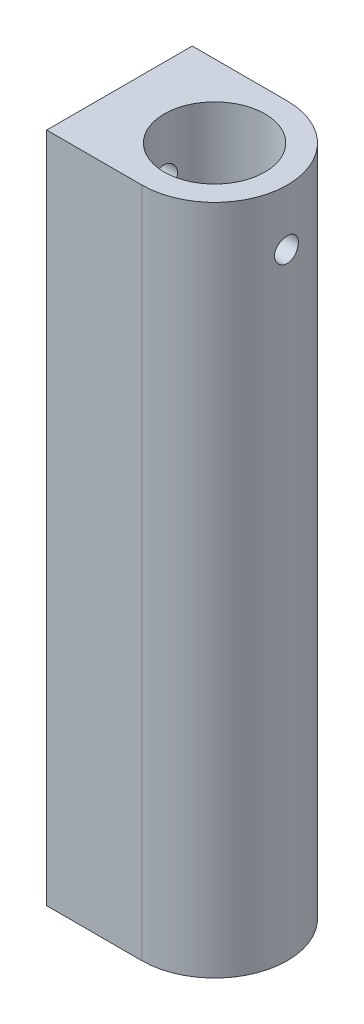
ISO-10303-21;
HEADER;
FILE_DESCRIPTION(('STEP AP214'),'2;1');
FILE_NAME('part.step','',(''),(''),'','','');
FILE_SCHEMA(('AUTOMOTIVE_DESIGN { 1 0 10303 214 1 1 1 1 }'));
ENDSEC;
DATA;
#1=APPLICATION_CONTEXT('core data for automotive mechanical design processes');
#2=APPLICATION_PROTOCOL_DEFINITION('international standard','automotive_design',2000,#1);
#3=PRODUCT_CONTEXT('',#1,'mechanical');
#4=PRODUCT('Part','Part','',(#3));
#5=PRODUCT_RELATED_PRODUCT_CATEGORY('part','',(#4));
#6=PRODUCT_DEFINITION_FORMATION('','',#4);
#7=PRODUCT_DEFINITION_CONTEXT('part definition',#1,'design');
#8=PRODUCT_DEFINITION('design','',#6,#7);
#9=PRODUCT_DEFINITION_SHAPE('','',#8);
#10=(LENGTH_UNIT() NAMED_UNIT(*) SI_UNIT(.MILLI.,.METRE.));
#11=(NAMED_UNIT(*) PLANE_ANGLE_UNIT() SI_UNIT($,.RADIAN.));
#12=(NAMED_UNIT(*) SI_UNIT($,.STERADIAN.) SOLID_ANGLE_UNIT());
#13=UNCERTAINTY_MEASURE_WITH_UNIT(LENGTH_MEASURE(1.E-05),#10,'distance_accuracy_value','');
#14=(GEOMETRIC_REPRESENTATION_CONTEXT(3) GLOBAL_UNCERTAINTY_ASSIGNED_CONTEXT((#13)) GLOBAL_UNIT_ASSIGNED_CONTEXT((#10,
#11,#12)) REPRESENTATION_CONTEXT('',''));
#15=CARTESIAN_POINT('',(0.,0.,0.));
#16=DIRECTION('',(0.,0.,1.));
#17=DIRECTION('',(1.,0.,0.));
#18=AXIS2_PLACEMENT_3D('',#15,#16,#17);
#19=CARTESIAN_POINT('',(0.,76.2,0.));
#20=DIRECTION('',(0.,-1.,0.));
#21=DIRECTION('',(0.,0.,-1.));
#22=AXIS2_PLACEMENT_3D('',#19,#20,#21);
#23=CYLINDRICAL_SURFACE('',#22,5.71500000000003);
#24=CARTESIAN_POINT('',(5.55264202857526,69.85,1.35254999999999));
#25=CARTESIAN_POINT('',(5.55264351524613,69.9248227648108,1.3525476616193));
#26=CARTESIAN_POINT('',(5.55417090006576,69.9996723482809,1.34632009430233));
#27=CARTESIAN_POINT('',(5.56010176398933,70.1472313061546,1.32160852948037));
#28=CARTESIAN_POINT('',(5.56450709471263,70.2199392711833,1.30311664121217));
#29=CARTESIAN_POINT('',(5.5756676105469,70.3610592934138,1.2545009118724));
#30=CARTESIAN_POINT('',(5.58241996342618,70.4294764115908,1.22439108576314));
#31=CARTESIAN_POINT('',(5.59751023452042,70.5602930408163,1.1534358149386));
#32=CARTESIAN_POINT('',(5.6058481765208,70.622692461572,1.11259020917229));
#33=CARTESIAN_POINT('',(5.62335427035189,70.7409345562503,1.02046227097579));
#34=CARTESIAN_POINT('',(5.63253454315145,70.7966409957032,0.96900735840718));
#35=CARTESIAN_POINT('',(5.65058534815188,70.898718744032,0.857493536514953));
#36=CARTESIAN_POINT('',(5.6594558535766,70.9450892475568,0.797433885680036));
#37=CARTESIAN_POINT('',(5.67602085762911,71.0277280916502,0.669490856613091));
#38=CARTESIAN_POINT('',(5.68369938377523,71.0638638253583,0.601519580684012));
#39=CARTESIAN_POINT('',(5.6968775869307,71.1241470655873,0.460256204066858));
#40=CARTESIAN_POINT('',(5.7023775511296,71.1482961523575,0.386964806213634));
#41=CARTESIAN_POINT('',(5.71049326078864,71.183487693132,0.238560391099673));
#42=CARTESIAN_POINT('',(5.71315978288332,71.1947611700738,0.163504981217602));
#43=CARTESIAN_POINT('',(5.71548465928469,71.2046053843291,0.0125240373825178));
#44=CARTESIAN_POINT('',(5.7151434139189,71.2031778121252,-0.0634013794309894));
#45=CARTESIAN_POINT('',(5.71152944874424,71.1878292205695,-0.212369109045626));
#46=CARTESIAN_POINT('',(5.70831520502753,71.1741574058119,-0.285438728174752));
#47=CARTESIAN_POINT('',(5.69938382358143,71.1351074593282,-0.428215861697039));
#48=CARTESIAN_POINT('',(5.69366656085319,71.1097287429651,-0.497923207987833));
#49=CARTESIAN_POINT('',(5.68028004409657,71.0477755561339,-0.632669122876195));
#50=CARTESIAN_POINT('',(5.67259497489801,71.011109865706,-0.697664114935426));
#51=CARTESIAN_POINT('',(5.65611053839926,70.9276921833154,-0.820667665633175));
#52=CARTESIAN_POINT('',(5.64731099560119,70.8809386019793,-0.87867512112045));
#53=CARTESIAN_POINT('',(5.62930803872549,70.7773269769817,-0.987541679842586));
#54=CARTESIAN_POINT('',(5.62010000673019,70.7202509654636,-1.03819277827648));
#55=CARTESIAN_POINT('',(5.60251563131345,70.5983187014695,-1.12924770378703));
#56=CARTESIAN_POINT('',(5.59413931895677,70.5334621585898,-1.169651148201));
#57=CARTESIAN_POINT('',(5.57915199811906,70.3974338068345,-1.23917869473598));
#58=CARTESIAN_POINT('',(5.57254810820835,70.3262380172882,-1.26825751851993));
#59=CARTESIAN_POINT('',(5.56194747659121,70.1797755835595,-1.31397176762377));
#60=CARTESIAN_POINT('',(5.55795024191089,70.1045097120336,-1.33060954589702));
#61=CARTESIAN_POINT('',(5.55311772405331,69.9539601569694,-1.35063432023462));
#62=CARTESIAN_POINT('',(5.55220956166735,69.8787193965297,-1.35432679506125));
#63=CARTESIAN_POINT('',(5.55346041844111,69.7286971635792,-1.34918838277682));
#64=CARTESIAN_POINT('',(5.55561918746122,69.6539156541114,-1.34035851699081));
#65=CARTESIAN_POINT('',(5.56269127266865,69.5080374908734,-1.31069272598908));
#66=CARTESIAN_POINT('',(5.56756473832492,69.4369034252776,-1.2900303760053));
#67=CARTESIAN_POINT('',(5.57948009775206,69.2991076837514,-1.23747658311869));
#68=CARTESIAN_POINT('',(5.58652222728782,69.2324464950472,-1.20558391926538));
#69=CARTESIAN_POINT('',(5.60213782763843,69.1041822078374,-1.13082067656576));
#70=CARTESIAN_POINT('',(5.61073629740711,69.0426901036257,-1.08776500852896));
#71=CARTESIAN_POINT('',(5.6284324303687,68.9276915275103,-0.992135544030387));
#72=CARTESIAN_POINT('',(5.6375301665689,68.8741862277882,-0.939560352938686));
#73=CARTESIAN_POINT('',(5.65544377046158,68.7754655784301,-0.824990859773358));
#74=CARTESIAN_POINT('',(5.66424892353381,68.7304602215983,-0.762813639491884));
#75=CARTESIAN_POINT('',(5.68037515911077,68.6515316712969,-0.631605388459973));
#76=CARTESIAN_POINT('',(5.68769631625094,68.6176079204414,-0.562574702654947));
#77=CARTESIAN_POINT('',(5.69998516779895,68.5620834525992,-0.420080240389863));
#78=CARTESIAN_POINT('',(5.70496899751391,68.5403980323958,-0.346650925581312));
#79=CARTESIAN_POINT('',(5.71209193177203,68.5097064467901,-0.197058316148823));
#80=CARTESIAN_POINT('',(5.71423152487176,68.5006981038215,-0.120895493370373));
#81=CARTESIAN_POINT('',(5.71540736098719,68.4957281255074,0.0300205206799673));
#82=CARTESIAN_POINT('',(5.71451768595446,68.4994550521556,0.104763043042596));
#83=CARTESIAN_POINT('',(5.70989677311692,68.5191438695859,0.252524330828096));
#84=CARTESIAN_POINT('',(5.70616560431054,68.5351054632802,0.32554313806262));
#85=CARTESIAN_POINT('',(5.69628981683616,68.5786509903334,0.467495588958035));
#86=CARTESIAN_POINT('',(5.69015579862002,68.6061839137737,0.536445665576282));
#87=CARTESIAN_POINT('',(5.67612407152788,68.6720431624455,0.668785397756567));
#88=CARTESIAN_POINT('',(5.6682261616386,68.7103707179646,0.732174418432411));
#89=CARTESIAN_POINT('',(5.65130752914006,68.7977101125625,0.853088636187553));
#90=CARTESIAN_POINT('',(5.64226607462953,68.8469367467123,0.910455788383431));
#91=CARTESIAN_POINT('',(5.62418037985841,68.9542526469028,1.0162212191982));
#92=CARTESIAN_POINT('',(5.61513613946189,69.0123441017951,1.0646172761704));
#93=CARTESIAN_POINT('',(5.59790307109146,69.1368770081757,1.15183311812056));
#94=CARTESIAN_POINT('',(5.5897305336767,69.2034388178053,1.19048449102752));
#95=CARTESIAN_POINT('',(5.57537851199577,69.3422969134659,1.25599052828391));
#96=CARTESIAN_POINT('',(5.56919747211505,69.4145886684035,1.28285440614138));
#97=CARTESIAN_POINT('',(5.56057354799463,69.5473728614855,1.3196671960351));
#98=CARTESIAN_POINT('',(5.55762040997625,69.607189827554,1.33197284091151));
#99=CARTESIAN_POINT('',(5.55365410949658,69.7279986384948,1.34841492110476));
#100=CARTESIAN_POINT('',(5.55264081636144,69.7889904039494,1.35255190668791));
#101=CARTESIAN_POINT('',(5.55264202857526,69.85,1.35254999999999));
#102=B_SPLINE_CURVE_WITH_KNOTS('',3,(#24,#25,#26,#27,#28,#29,#30,#31,#32,#33,#34,#35,#36,#37,
#38,#39,#40,#41,#42,#43,#44,#45,#46,#47,#48,#49,#50,#51,#52,#53,#54,#55,#56,#57,#58,#59,#60,#61,
#62,#63,#64,#65,#66,#67,#68,#69,#70,#71,#72,#73,#74,#75,#76,#77,#78,#79,#80,#81,#82,#83,#84,#85,
#86,#87,#88,#89,#90,#91,#92,#93,#94,#95,#96,#97,#98,#99,#100,#101),.UNSPECIFIED.,.T.,.F.,(4,2,2,
2,2,2,2,2,2,2,2,2,2,2,2,2,2,2,2,2,2,2,2,2,2,2,2,2,2,2,2,2,2,2,2,2,2,2,4),(0.,0.22424445559196,
0.448633328365857,0.672752358152372,0.896874750215145,1.12498023223408,1.35310538302606,
1.5840635451362,1.81499125097995,2.04170698092736,2.26839253594338,2.49056669325519,
2.71275194704034,2.9367822363099,3.16084784794028,3.39035931086852,3.61987934283606,
3.85030784970728,4.08069276500401,4.30560312772247,4.5304951477536,4.75216968989722,
4.97386833975901,5.19950843214301,5.42518160805617,5.65585597456943,5.88651873676893,
6.11556483013412,6.34457157500167,6.56801849870223,6.79145999673531,7.01392666112695,
7.2364186907925,7.46376332960535,7.69116419417978,7.92226069130641,8.15317623235427,
8.33603482331129,8.51888109592415),.UNSPECIFIED.);
#103=CARTESIAN_POINT('',(5.55264202857526,69.85,1.35254999999999));
#104=VERTEX_POINT('',#103);
#105=EDGE_CURVE('E46',#104,#104,#102,.T.);
#106=ORIENTED_EDGE('',*,*,#105,.F.);
#107=EDGE_LOOP('',(#106));
#108=FACE_BOUND('',#107,.T.);
#109=CARTESIAN_POINT('',(-5.55264202857525,69.85,1.35254999999999));
#110=CARTESIAN_POINT('',(-5.55264351524613,69.7751772351892,1.3525476616193));
#111=CARTESIAN_POINT('',(-5.55417090006576,69.7003276517191,1.34632009430233));
#112=CARTESIAN_POINT('',(-5.56010176398933,69.5527686938454,1.32160852948037));
#113=CARTESIAN_POINT('',(-5.56450709471263,69.4800607288168,1.30311664121217));
#114=CARTESIAN_POINT('',(-5.5756676105469,69.3389407065863,1.2545009118724));
#115=CARTESIAN_POINT('',(-5.58241996342618,69.2705235884092,1.22439108576314));
#116=CARTESIAN_POINT('',(-5.59751023452042,69.1397069591837,1.1534358149386));
#117=CARTESIAN_POINT('',(-5.6058481765208,69.077307538428,1.11259020917229));
#118=CARTESIAN_POINT('',(-5.62335427035189,68.9590654437497,1.02046227097579));
#119=CARTESIAN_POINT('',(-5.63253454315145,68.9033590042968,0.96900735840718));
#120=CARTESIAN_POINT('',(-5.65058534815188,68.801281255968,0.857493536514953));
#121=CARTESIAN_POINT('',(-5.6594558535766,68.7549107524432,0.797433885680036));
#122=CARTESIAN_POINT('',(-5.67602085762911,68.6722719083498,0.669490856613091));
#123=CARTESIAN_POINT('',(-5.68369938377523,68.6361361746417,0.601519580684012));
#124=CARTESIAN_POINT('',(-5.6968775869307,68.5758529344127,0.460256204066858));
#125=CARTESIAN_POINT('',(-5.7023775511296,68.5517038476425,0.386964806213634));
#126=CARTESIAN_POINT('',(-5.71049326078864,68.5165123068681,0.238560391099673));
#127=CARTESIAN_POINT('',(-5.71315978288332,68.5052388299262,0.163504981217602));
#128=CARTESIAN_POINT('',(-5.71548465928469,68.4953946156709,0.012524037382518));
#129=CARTESIAN_POINT('',(-5.7151434139189,68.4968221878748,-0.0634013794309892));
#130=CARTESIAN_POINT('',(-5.71152944874424,68.5121707794305,-0.212369109045626));
#131=CARTESIAN_POINT('',(-5.70831520502753,68.5258425941881,-0.285438728174752));
#132=CARTESIAN_POINT('',(-5.69938382358143,68.5648925406718,-0.428215861697039));
#133=CARTESIAN_POINT('',(-5.69366656085319,68.590271257035,-0.497923207987833));
#134=CARTESIAN_POINT('',(-5.68028004409657,68.6522244438661,-0.632669122876195));
#135=CARTESIAN_POINT('',(-5.67259497489801,68.688890134294,-0.697664114935425));
#136=CARTESIAN_POINT('',(-5.65611053839926,68.7723078166846,-0.820667665633175));
#137=CARTESIAN_POINT('',(-5.64731099560119,68.8190613980207,-0.87867512112045));
#138=CARTESIAN_POINT('',(-5.62930803872549,68.9226730230184,-0.987541679842586));
#139=CARTESIAN_POINT('',(-5.62010000673019,68.9797490345364,-1.03819277827648));
#140=CARTESIAN_POINT('',(-5.60251563131345,69.1016812985306,-1.12924770378703));
#141=CARTESIAN_POINT('',(-5.59413931895677,69.1665378414102,-1.169651148201));
#142=CARTESIAN_POINT('',(-5.57915199811906,69.3025661931655,-1.23917869473597));
#143=CARTESIAN_POINT('',(-5.57254810820835,69.3737619827118,-1.26825751851993));
#144=CARTESIAN_POINT('',(-5.56194747659121,69.5202244164405,-1.31397176762376));
#145=CARTESIAN_POINT('',(-5.55795024191089,69.5954902879664,-1.33060954589702));
#146=CARTESIAN_POINT('',(-5.55311772405331,69.7460398430307,-1.35063432023462));
#147=CARTESIAN_POINT('',(-5.55220956166735,69.8212806034703,-1.35432679506125));
#148=CARTESIAN_POINT('',(-5.55346041844111,69.9713028364208,-1.34918838277682));
#149=CARTESIAN_POINT('',(-5.55561918746122,70.0460843458886,-1.34035851699081));
#150=CARTESIAN_POINT('',(-5.56269127266865,70.1919625091266,-1.31069272598908));
#151=CARTESIAN_POINT('',(-5.56756473832492,70.2630965747224,-1.2900303760053));
#152=CARTESIAN_POINT('',(-5.57948009775206,70.4008923162486,-1.23747658311869));
#153=CARTESIAN_POINT('',(-5.58652222728782,70.4675535049529,-1.20558391926538));
#154=CARTESIAN_POINT('',(-5.60213782763843,70.5958177921626,-1.13082067656576));
#155=CARTESIAN_POINT('',(-5.61073629740711,70.6573098963743,-1.08776500852896));
#156=CARTESIAN_POINT('',(-5.6284324303687,70.7723084724898,-0.992135544030387));
#157=CARTESIAN_POINT('',(-5.6375301665689,70.8258137722118,-0.939560352938685));
#158=CARTESIAN_POINT('',(-5.65544377046158,70.9245344215699,-0.82499085977336));
#159=CARTESIAN_POINT('',(-5.66424892353381,70.9695397784017,-0.762813639491889));
#160=CARTESIAN_POINT('',(-5.68037515911077,71.0484683287031,-0.631605388459978));
#161=CARTESIAN_POINT('',(-5.68769631625094,71.0823920795586,-0.562574702654949));
#162=CARTESIAN_POINT('',(-5.69998516779895,71.1379165474008,-0.420080240389863));
#163=CARTESIAN_POINT('',(-5.70496899751391,71.1596019676042,-0.346650925581312));
#164=CARTESIAN_POINT('',(-5.71209193177203,71.19029355321,-0.197058316148824));
#165=CARTESIAN_POINT('',(-5.71423152487176,71.1993018961785,-0.120895493370373));
#166=CARTESIAN_POINT('',(-5.71540736098719,71.2042718744927,0.0300205206799667));
#167=CARTESIAN_POINT('',(-5.71451768595446,71.2005449478444,0.104763043042595));
#168=CARTESIAN_POINT('',(-5.70989677311692,71.1808561304141,0.252524330828095));
#169=CARTESIAN_POINT('',(-5.70616560431054,71.1648945367198,0.32554313806262));
#170=CARTESIAN_POINT('',(-5.69628981683617,71.1213490096666,0.467495588958033));
#171=CARTESIAN_POINT('',(-5.69015579862002,71.0938160862263,0.536445665576277));
#172=CARTESIAN_POINT('',(-5.67612407152788,71.0279568375545,0.668785397756563));
#173=CARTESIAN_POINT('',(-5.66822616163861,70.9896292820355,0.73217441843241));
#174=CARTESIAN_POINT('',(-5.65130752914006,70.9022898874375,0.853088636187553));
#175=CARTESIAN_POINT('',(-5.64226607462953,70.8530632532877,0.91045578838343));
#176=CARTESIAN_POINT('',(-5.62418037985841,70.7457473530972,1.0162212191982));
#177=CARTESIAN_POINT('',(-5.61513613946189,70.6876558982049,1.0646172761704));
#178=CARTESIAN_POINT('',(-5.59790307109146,70.5631229918243,1.15183311812056));
#179=CARTESIAN_POINT('',(-5.58973053367669,70.4965611821947,1.19048449102752));
#180=CARTESIAN_POINT('',(-5.57537851199577,70.3577030865341,1.25599052828391));
#181=CARTESIAN_POINT('',(-5.56919747211505,70.2854113315965,1.28285440614138));
#182=CARTESIAN_POINT('',(-5.56057354799463,70.1526271385146,1.3196671960351));
#183=CARTESIAN_POINT('',(-5.55762040997625,70.0928101724461,1.33197284091151));
#184=CARTESIAN_POINT('',(-5.55365410949657,69.9720013615052,1.34841492110476));
#185=CARTESIAN_POINT('',(-5.55264081636144,69.9110095960506,1.35255190668791));
#186=CARTESIAN_POINT('',(-5.55264202857525,69.85,1.35254999999999));
#187=B_SPLINE_CURVE_WITH_KNOTS('',3,(#109,#110,#111,#112,#113,#114,#115,#116,#117,#118,#119,
#120,#121,#122,#123,#124,#125,#126,#127,#128,#129,#130,#131,#132,#133,#134,#135,#136,#137,#138,
#139,#140,#141,#142,#143,#144,#145,#146,#147,#148,#149,#150,#151,#152,#153,#154,#155,#156,#157,
#158,#159,#160,#161,#162,#163,#164,#165,#166,#167,#168,#169,#170,#171,#172,#173,#174,#175,#176,
#177,#178,#179,#180,#181,#182,#183,#184,#185,#186),.UNSPECIFIED.,.T.,.F.,(4,2,2,2,2,2,2,2,2,2,2,
2,2,2,2,2,2,2,2,2,2,2,2,2,2,2,2,2,2,2,2,2,2,2,2,2,2,2,4),(0.,0.22424445559196,0.448633328365857,
0.672752358152372,0.896874750215145,1.12498023223408,1.35310538302606,1.5840635451362,
1.81499125097995,2.04170698092736,2.26839253594338,2.49056669325519,2.71275194704034,
2.9367822363099,3.16084784794028,3.39035931086852,3.61987934283606,3.85030784970727,
4.08069276500401,4.30560312772247,4.5304951477536,4.75216968989722,4.97386833975901,
5.19950843214301,5.42518160805617,5.65585597456943,5.88651873676893,6.11556483013412,
6.34457157500167,6.56801849870223,6.79145999673531,7.01392666112695,7.2364186907925,
7.46376332960535,7.69116419417978,7.92226069130642,8.15317623235427,8.33603482331129,
8.51888109592415),.UNSPECIFIED.);
#188=CARTESIAN_POINT('',(-5.55264202857525,69.85,1.35254999999999));
#189=VERTEX_POINT('',#188);
#190=EDGE_CURVE('E123',#189,#189,#187,.T.);
#191=ORIENTED_EDGE('',*,*,#190,.F.);
#192=EDGE_LOOP('',(#191));
#193=FACE_BOUND('',#192,.T.);
#194=CARTESIAN_POINT('',(0.,76.2,0.));
#195=DIRECTION('',(0.,1.,0.));
#196=DIRECTION('',(0.,0.,1.));
#197=AXIS2_PLACEMENT_3D('',#194,#195,#196);
#198=CIRCLE('',#197,5.71500000000003);
#199=CARTESIAN_POINT('',(0.,76.2,5.71500000000003));
#200=VERTEX_POINT('',#199);
#201=EDGE_CURVE('E118',#200,#200,#198,.T.);
#202=ORIENTED_EDGE('',*,*,#201,.T.);
#203=EDGE_LOOP('',(#202));
#204=FACE_BOUND('',#203,.T.);
#205=CARTESIAN_POINT('',(0.,3.81,0.));
#206=DIRECTION('',(0.,-1.,0.));
#207=DIRECTION('',(0.,0.,-1.));
#208=AXIS2_PLACEMENT_3D('',#205,#206,#207);
#209=CIRCLE('',#208,5.71500000000003);
#210=CARTESIAN_POINT('',(0.,3.81,-5.71500000000003));
#211=VERTEX_POINT('',#210);
#212=EDGE_CURVE('E153',#211,#211,#209,.T.);
#213=ORIENTED_EDGE('',*,*,#212,.T.);
#214=EDGE_LOOP('',(#213));
#215=FACE_BOUND('',#214,.T.);
#216=ADVANCED_FACE('F41',(#108,#193,#204,#215),#23,.F.);
#217=CARTESIAN_POINT('',(0.,76.2,0.));
#218=DIRECTION('',(0.,1.,0.));
#219=DIRECTION('',(0.,0.,1.));
#220=AXIS2_PLACEMENT_3D('',#217,#218,#219);
#221=PLANE('',#220);
#222=CARTESIAN_POINT('',(0.,76.2,0.));
#223=DIRECTION('',(0.,1.,0.));
#224=DIRECTION('',(0.,0.,1.));
#225=AXIS2_PLACEMENT_3D('',#222,#223,#224);
#226=CIRCLE('',#225,8.255);
#227=CARTESIAN_POINT('',(0.,76.2,8.255));
#228=VERTEX_POINT('',#227);
#229=CARTESIAN_POINT('',(0.,76.2,-8.255));
#230=VERTEX_POINT('',#229);
#231=EDGE_CURVE('E102',#228,#230,#226,.T.);
#232=ORIENTED_EDGE('',*,*,#231,.T.);
#233=DIRECTION('',(-1.,0.,0.));
#234=VECTOR('',#233,1.);
#235=CARTESIAN_POINT('',(0.,76.2,-8.255));
#236=LINE('',#235,#234);
#237=CARTESIAN_POINT('',(-10.795,76.2,-8.255));
#238=VERTEX_POINT('',#237);
#239=EDGE_CURVE('E96',#230,#238,#236,.T.);
#240=ORIENTED_EDGE('',*,*,#239,.T.);
#241=DIRECTION('',(0.,0.,1.));
#242=VECTOR('',#241,1.);
#243=CARTESIAN_POINT('',(-10.795,76.2,-8.255));
#244=LINE('',#243,#242);
#245=CARTESIAN_POINT('',(-10.795,76.2,8.255));
#246=VERTEX_POINT('',#245);
#247=EDGE_CURVE('E100',#238,#246,#244,.T.);
#248=ORIENTED_EDGE('',*,*,#247,.T.);
#249=DIRECTION('',(1.,0.,0.));
#250=VECTOR('',#249,1.);
#251=CARTESIAN_POINT('',(-10.795,76.2,8.255));
#252=LINE('',#251,#250);
#253=EDGE_CURVE('E66',#246,#228,#252,.T.);
#254=ORIENTED_EDGE('',*,*,#253,.T.);
#255=EDGE_LOOP('',(#232,#240,#248,#254));
#256=FACE_BOUND('',#255,.T.);
#257=ORIENTED_EDGE('',*,*,#201,.F.);
#258=EDGE_LOOP('',(#257));
#259=FACE_BOUND('',#258,.T.);
#260=ADVANCED_FACE('F97',(#256,#259),#221,.T.);
#261=CARTESIAN_POINT('',(0.,0.,0.));
#262=DIRECTION('',(0.,1.,0.));
#263=DIRECTION('',(0.,0.,1.));
#264=AXIS2_PLACEMENT_3D('',#261,#262,#263);
#265=PLANE('',#264);
#266=CARTESIAN_POINT('',(0.,0.,0.));
#267=DIRECTION('',(0.,1.,0.));
#268=DIRECTION('',(0.,0.,1.));
#269=AXIS2_PLACEMENT_3D('',#266,#267,#268);
#270=CIRCLE('',#269,8.255);
#271=CARTESIAN_POINT('',(0.,0.,8.255));
#272=VERTEX_POINT('',#271);
#273=CARTESIAN_POINT('',(0.,0.,-8.255));
#274=VERTEX_POINT('',#273);
#275=EDGE_CURVE('E115',#272,#274,#270,.T.);
#276=ORIENTED_EDGE('',*,*,#275,.F.);
#277=DIRECTION('',(1.,0.,0.));
#278=VECTOR('',#277,1.);
#279=CARTESIAN_POINT('',(-10.795,0.,8.255));
#280=LINE('',#279,#278);
#281=CARTESIAN_POINT('',(-10.795,0.,8.255));
#282=VERTEX_POINT('',#281);
#283=EDGE_CURVE('E89',#282,#272,#280,.T.);
#284=ORIENTED_EDGE('',*,*,#283,.F.);
#285=DIRECTION('',(0.,0.,1.));
#286=VECTOR('',#285,1.);
#287=CARTESIAN_POINT('',(-10.795,0.,-8.255));
#288=LINE('',#287,#286);
#289=CARTESIAN_POINT('',(-10.795,0.,-8.255));
#290=VERTEX_POINT('',#289);
#291=EDGE_CURVE('E83',#290,#282,#288,.T.);
#292=ORIENTED_EDGE('',*,*,#291,.F.);
#293=DIRECTION('',(-1.,0.,0.));
#294=VECTOR('',#293,1.);
#295=CARTESIAN_POINT('',(0.,0.,-8.255));
#296=LINE('',#295,#294);
#297=EDGE_CURVE('E106',#274,#290,#296,.T.);
#298=ORIENTED_EDGE('',*,*,#297,.F.);
#299=EDGE_LOOP('',(#276,#284,#292,#298));
#300=FACE_BOUND('',#299,.T.);
#301=CARTESIAN_POINT('',(0.,0.,0.));
#302=DIRECTION('',(0.,-1.,0.));
#303=DIRECTION('',(0.,0.,-1.));
#304=AXIS2_PLACEMENT_3D('',#301,#302,#303);
#305=CIRCLE('',#304,5.207);
#306=CARTESIAN_POINT('',(0.,0.,-5.207));
#307=VERTEX_POINT('',#306);
#308=EDGE_CURVE('E149',#307,#307,#305,.T.);
#309=ORIENTED_EDGE('',*,*,#308,.F.);
#310=EDGE_LOOP('',(#309));
#311=FACE_BOUND('',#310,.T.);
#312=ADVANCED_FACE('F163',(#300,#311),#265,.F.);
#313=CARTESIAN_POINT('',(0.,76.2,0.));
#314=DIRECTION('',(0.,-1.,0.));
#315=DIRECTION('',(0.,0.,-1.));
#316=AXIS2_PLACEMENT_3D('',#313,#314,#315);
#317=CYLINDRICAL_SURFACE('',#316,8.255);
#318=CARTESIAN_POINT('',(8.255,68.49745,0.));
#319=CARTESIAN_POINT('',(8.25499872030116,68.497453040629,0.0754318714603307));
#320=CARTESIAN_POINT('',(8.25395530596266,68.5037815806345,0.150905370240681));
#321=CARTESIAN_POINT('',(8.24989338531419,68.5289187318963,0.299736840637257));
#322=CARTESIAN_POINT('',(8.24687304395461,68.5477389385627,0.373092780546248));
#323=CARTESIAN_POINT('',(8.23919615474866,68.5972769832403,0.515514205885351));
#324=CARTESIAN_POINT('',(8.23454092776231,68.627985218695,0.584583102060726));
#325=CARTESIAN_POINT('',(8.22410657147275,68.700402773588,0.716578876553847));
#326=CARTESIAN_POINT('',(8.21832757556119,68.7421107875587,0.779506482514217));
#327=CARTESIAN_POINT('',(8.20622688718008,68.8357545894534,0.898024749310927));
#328=CARTESIAN_POINT('',(8.199901097279,68.887772206103,0.953550344099739));
#329=CARTESIAN_POINT('',(8.18745126272849,69.0003824980704,1.05512649253797));
#330=CARTESIAN_POINT('',(8.18132723062825,69.0609757055474,1.10117645774049));
#331=CARTESIAN_POINT('',(8.16993460371935,69.1894624139224,1.18275361095));
#332=CARTESIAN_POINT('',(8.16467130364283,69.2573971218763,1.21821670037647));
#333=CARTESIAN_POINT('',(8.15565276228842,69.3983597935483,1.27720358295155));
#334=CARTESIAN_POINT('',(8.15189742265198,69.4713874247096,1.30072815483093));
#335=CARTESIAN_POINT('',(8.14636069596571,69.6197741678218,1.33496573254625));
#336=CARTESIAN_POINT('',(8.14456203646476,69.6951067417741,1.34579090920359));
#337=CARTESIAN_POINT('',(8.14309003845822,69.8465388827084,1.35467014436836));
#338=CARTESIAN_POINT('',(8.14341655457654,69.9226383968711,1.35272507644499));
#339=CARTESIAN_POINT('',(8.14614224127868,70.0726449740062,1.3362104554244));
#340=CARTESIAN_POINT('',(8.14852075479759,70.1465663184217,1.32176671964903));
#341=CARTESIAN_POINT('',(8.155050114082,70.2909220389895,1.28086213071017));
#342=CARTESIAN_POINT('',(8.15920101876903,70.3613562991301,1.25440087803337));
#343=CARTESIAN_POINT('',(8.16882986125228,70.4971162215938,1.1900842525552));
#344=CARTESIAN_POINT('',(8.17431388227117,70.56241659581,1.15217644959844));
#345=CARTESIAN_POINT('',(8.18598679300163,70.6857772527276,1.06608003185161));
#346=CARTESIAN_POINT('',(8.19217573771772,70.7438369697061,1.01789061454077));
#347=CARTESIAN_POINT('',(8.2046520131746,70.8517966592849,0.911912471719937));
#348=CARTESIAN_POINT('',(8.21093963489579,70.9015906518813,0.85401575682891));
#349=CARTESIAN_POINT('',(8.2228362792801,70.9907726404057,0.730632218159171));
#350=CARTESIAN_POINT('',(8.22844529783858,71.0301605733927,0.665145348474978));
#351=CARTESIAN_POINT('',(8.23836032943799,71.0974212656544,0.528342157688782));
#352=CARTESIAN_POINT('',(8.24266530603429,71.125284871857,0.457021256610344));
#353=CARTESIAN_POINT('',(8.24947882107934,71.168608710762,0.310625857775448));
#354=CARTESIAN_POINT('',(8.25198750470403,71.184069945833,0.2355516638839));
#355=CARTESIAN_POINT('',(8.2549063035598,71.2020069700327,0.0846944259006028));
#356=CARTESIAN_POINT('',(8.25533993584845,71.2046282851534,0.00892912390167017));
#357=CARTESIAN_POINT('',(8.25412411502053,71.1971987368701,-0.141958267667608));
#358=CARTESIAN_POINT('',(8.25247473927483,71.1871483441419,-0.217080381024096));
#359=CARTESIAN_POINT('',(8.24729278506509,71.1547817104132,-0.36410098629153));
#360=CARTESIAN_POINT('',(8.24377124073046,71.1325373143821,-0.436015717359872));
#361=CARTESIAN_POINT('',(8.23523828162005,71.0764905543834,-0.575095138999136));
#362=CARTESIAN_POINT('',(8.23022678552754,71.04268755957,-0.642259570066397));
#363=CARTESIAN_POINT('',(8.21921169094072,70.9641484165671,-0.770565331327349));
#364=CARTESIAN_POINT('',(8.21319996363211,70.9193211160009,-0.831650153681653));
#365=CARTESIAN_POINT('',(8.20087634197304,70.8201315000828,-0.945482097124415));
#366=CARTESIAN_POINT('',(8.1945644266183,70.765768516798,-0.998228633659997));
#367=CARTESIAN_POINT('',(8.18227603700609,70.6483988550441,-1.09442441622771));
#368=CARTESIAN_POINT('',(8.17630354581254,70.5853112174761,-1.13777547162646));
#369=CARTESIAN_POINT('',(8.16544394118775,70.4526637200299,-1.21326452731937));
#370=CARTESIAN_POINT('',(8.16055679420151,70.3831040603379,-1.24540287428818));
#371=CARTESIAN_POINT('',(8.15245092465226,70.2397648215224,-1.29740642584038));
#372=CARTESIAN_POINT('',(8.14922549973799,70.1660035486182,-1.31732099678325));
#373=CARTESIAN_POINT('',(8.14479127658156,70.0161257939676,-1.34446736955916));
#374=CARTESIAN_POINT('',(8.14358230946336,69.9400095099946,-1.35170023347321));
#375=CARTESIAN_POINT('',(8.14332499499137,69.7885625660129,-1.35324902182466));
#376=CARTESIAN_POINT('',(8.14425080010267,69.7132334854172,-1.34771947109258));
#377=CARTESIAN_POINT('',(8.14810215040292,69.5645927798348,-1.32423399925289));
#378=CARTESIAN_POINT('',(8.15102768972845,69.4912811489333,-1.30627811458055));
#379=CARTESIAN_POINT('',(8.15853918906154,69.348813171308,-1.25850808257056));
#380=CARTESIAN_POINT('',(8.16312334718085,69.2796524098673,-1.2287068003714));
#381=CARTESIAN_POINT('',(8.17343738485351,69.147287279488,-1.15810769923651));
#382=CARTESIAN_POINT('',(8.17916731809134,69.0840831898493,-1.1173093650106));
#383=CARTESIAN_POINT('',(8.19120943828138,68.9646440428239,-1.02532102703818));
#384=CARTESIAN_POINT('',(8.19752754972055,68.9084972330344,-0.974017200991827));
#385=CARTESIAN_POINT('',(8.20998649503464,68.8055563573428,-0.862714371170665));
#386=CARTESIAN_POINT('',(8.21612728761811,68.7587644550863,-0.802713361394235));
#387=CARTESIAN_POINT('',(8.22758692577901,68.6755781826331,-0.67524570433435));
#388=CARTESIAN_POINT('',(8.2329000317453,68.6392550509179,-0.60773204844395));
#389=CARTESIAN_POINT('',(8.2420497489218,68.5785208935354,-0.467502700813454));
#390=CARTESIAN_POINT('',(8.2458878402178,68.5540979201685,-0.394792311045017));
#391=CARTESIAN_POINT('',(8.25081069178441,68.523200831898,-0.268159549175887));
#392=CARTESIAN_POINT('',(8.25237334360854,68.5135596093786,-0.215006117100265));
#393=CARTESIAN_POINT('',(8.25446844707369,68.50068315801,-0.107908883293362));
#394=CARTESIAN_POINT('',(8.25500091551577,68.4974478246884,-0.0539650944663177));
#395=CARTESIAN_POINT('',(8.255,68.49745,0.));
#396=B_SPLINE_CURVE_WITH_KNOTS('',3,(#318,#319,#320,#321,#322,#323,#324,#325,#326,#327,#328,
#329,#330,#331,#332,#333,#334,#335,#336,#337,#338,#339,#340,#341,#342,#343,#344,#345,#346,#347,
#348,#349,#350,#351,#352,#353,#354,#355,#356,#357,#358,#359,#360,#361,#362,#363,#364,#365,#366,
#367,#368,#369,#370,#371,#372,#373,#374,#375,#376,#377,#378,#379,#380,#381,#382,#383,#384,#385,
#386,#387,#388,#389,#390,#391,#392,#393,#394,#395),.UNSPECIFIED.,.T.,.F.,(4,2,2,2,2,2,2,2,2,2,2,
2,2,2,2,2,2,2,2,2,2,2,2,2,2,2,2,2,2,2,2,2,2,2,2,2,2,2,4),(0.,0.226098367666559,
0.452406905580689,0.678533022887217,0.904632315330269,1.13260376188363,1.36058936144169,
1.58992854619892,1.81925276959759,2.04653579895442,2.2738032808106,2.49880925151089,
2.72382270291312,2.94988286359022,3.1759606756186,3.40474437900172,3.63352946614763,
3.86249591604688,4.09144385884839,4.31779083356166,4.5441294011298,4.76914853416564,
4.99417995026946,5.22113853615341,5.44811302584765,5.67735601230531,5.90659191039757,
6.13489582912458,6.3631806267001,6.58871591925351,6.8142505505173,7.0395408978278,
7.26484180343097,7.49272684647048,7.72066453498069,7.95011853942595,8.17934169606252,
8.34109850428129,8.50285267441643),.UNSPECIFIED.);
#397=CARTESIAN_POINT('',(8.255,68.49745,0.));
#398=VERTEX_POINT('',#397);
#399=EDGE_CURVE('E142',#398,#398,#396,.T.);
#400=ORIENTED_EDGE('',*,*,#399,.T.);
#401=EDGE_LOOP('',(#400));
#402=FACE_BOUND('',#401,.T.);
#403=ORIENTED_EDGE('',*,*,#275,.T.);
#404=DIRECTION('',(0.,-1.,0.));
#405=VECTOR('',#404,1.);
#406=CARTESIAN_POINT('',(0.,76.2,-8.255));
#407=LINE('',#406,#405);
#408=EDGE_CURVE('E11',#230,#274,#407,.T.);
#409=ORIENTED_EDGE('',*,*,#408,.F.);
#410=ORIENTED_EDGE('',*,*,#231,.F.);
#411=DIRECTION('',(0.,-1.,0.));
#412=VECTOR('',#411,1.);
#413=CARTESIAN_POINT('',(0.,76.2,8.255));
#414=LINE('',#413,#412);
#415=EDGE_CURVE('E111',#228,#272,#414,.T.);
#416=ORIENTED_EDGE('',*,*,#415,.T.);
#417=EDGE_LOOP('',(#403,#409,#410,#416));
#418=FACE_BOUND('',#417,.T.);
#419=ADVANCED_FACE('F43',(#402,#418),#317,.T.);
#420=CARTESIAN_POINT('',(0.,76.2,-8.255));
#421=DIRECTION('',(0.,0.,1.));
#422=DIRECTION('',(1.,0.,0.));
#423=AXIS2_PLACEMENT_3D('',#420,#421,#422);
#424=PLANE('',#423);
#425=ORIENTED_EDGE('',*,*,#297,.T.);
#426=DIRECTION('',(0.,-1.,0.));
#427=VECTOR('',#426,1.);
#428=CARTESIAN_POINT('',(-10.795,76.2,-8.255));
#429=LINE('',#428,#427);
#430=EDGE_CURVE('E57',#238,#290,#429,.T.);
#431=ORIENTED_EDGE('',*,*,#430,.F.);
#432=ORIENTED_EDGE('',*,*,#239,.F.);
#433=ORIENTED_EDGE('',*,*,#408,.T.);
#434=EDGE_LOOP('',(#425,#431,#432,#433));
#435=FACE_BOUND('',#434,.T.);
#436=ADVANCED_FACE('F105',(#435),#424,.F.);
#437=CARTESIAN_POINT('',(-10.795,76.2,-8.255));
#438=DIRECTION('',(1.,0.,0.));
#439=DIRECTION('',(0.,0.,-1.));
#440=AXIS2_PLACEMENT_3D('',#437,#438,#439);
#441=PLANE('',#440);
#442=CARTESIAN_POINT('',(-10.795,69.85,0.));
#443=DIRECTION('',(-1.,0.,0.));
#444=DIRECTION('',(0.,0.,1.));
#445=AXIS2_PLACEMENT_3D('',#442,#443,#444);
#446=CIRCLE('',#445,1.35254999999999);
#447=CARTESIAN_POINT('',(-10.795,69.85,1.35254999999999));
#448=VERTEX_POINT('',#447);
#449=EDGE_CURVE('E128',#448,#448,#446,.T.);
#450=ORIENTED_EDGE('',*,*,#449,.F.);
#451=EDGE_LOOP('',(#450));
#452=FACE_BOUND('',#451,.T.);
#453=ORIENTED_EDGE('',*,*,#291,.T.);
#454=DIRECTION('',(0.,-1.,0.));
#455=VECTOR('',#454,1.);
#456=CARTESIAN_POINT('',(-10.795,76.2,8.255));
#457=LINE('',#456,#455);
#458=EDGE_CURVE('E107',#246,#282,#457,.T.);
#459=ORIENTED_EDGE('',*,*,#458,.F.);
#460=ORIENTED_EDGE('',*,*,#247,.F.);
#461=ORIENTED_EDGE('',*,*,#430,.T.);
#462=EDGE_LOOP('',(#453,#459,#460,#461));
#463=FACE_BOUND('',#462,.T.);
#464=ADVANCED_FACE('F109',(#452,#463),#441,.F.);
#465=CARTESIAN_POINT('',(-10.795,76.2,8.255));
#466=DIRECTION('',(0.,0.,-1.));
#467=DIRECTION('',(-1.,0.,0.));
#468=AXIS2_PLACEMENT_3D('',#465,#466,#467);
#469=PLANE('',#468);
#470=ORIENTED_EDGE('',*,*,#283,.T.);
#471=ORIENTED_EDGE('',*,*,#415,.F.);
#472=ORIENTED_EDGE('',*,*,#253,.F.);
#473=ORIENTED_EDGE('',*,*,#458,.T.);
#474=EDGE_LOOP('',(#470,#471,#472,#473));
#475=FACE_BOUND('',#474,.T.);
#476=ADVANCED_FACE('F172',(#475),#469,.F.);
#477=CARTESIAN_POINT('',(0.,3.81,0.));
#478=DIRECTION('',(0.,-1.,0.));
#479=DIRECTION('',(0.,0.,-1.));
#480=AXIS2_PLACEMENT_3D('',#477,#478,#479);
#481=PLANE('',#480);
#482=CARTESIAN_POINT('',(0.,3.81,0.));
#483=DIRECTION('',(0.,-1.,0.));
#484=DIRECTION('',(0.,0.,-1.));
#485=AXIS2_PLACEMENT_3D('',#482,#483,#484);
#486=CIRCLE('',#485,5.207);
#487=CARTESIAN_POINT('',(0.,3.81,-5.207));
#488=VERTEX_POINT('',#487);
#489=EDGE_CURVE('E150',#488,#488,#486,.T.);
#490=ORIENTED_EDGE('',*,*,#489,.T.);
#491=EDGE_LOOP('',(#490));
#492=FACE_BOUND('',#491,.T.);
#493=ORIENTED_EDGE('',*,*,#212,.F.);
#494=EDGE_LOOP('',(#493));
#495=FACE_BOUND('',#494,.T.);
#496=ADVANCED_FACE('F175',(#492,#495),#481,.F.);
#497=CARTESIAN_POINT('',(0.,3.81,0.));
#498=DIRECTION('',(0.,-1.,0.));
#499=DIRECTION('',(0.,0.,-1.));
#500=AXIS2_PLACEMENT_3D('',#497,#498,#499);
#501=CYLINDRICAL_SURFACE('',#500,5.207);
#502=CARTESIAN_POINT('',(0.,3.81,-5.207));
#503=CARTESIAN_POINT('',(0.,3.7703125,-5.207));
#504=CARTESIAN_POINT('',(0.,3.730625,-5.207));
#505=CARTESIAN_POINT('',(0.,3.65125,-5.207));
#506=CARTESIAN_POINT('',(0.,3.6115625,-5.207));
#507=CARTESIAN_POINT('',(0.,3.5321875,-5.207));
#508=CARTESIAN_POINT('',(0.,3.4925,-5.207));
#509=CARTESIAN_POINT('',(0.,3.413125,-5.207));
#510=CARTESIAN_POINT('',(0.,3.3734375,-5.207));
#511=CARTESIAN_POINT('',(0.,3.2940625,-5.207));
#512=CARTESIAN_POINT('',(0.,3.254375,-5.207));
#513=CARTESIAN_POINT('',(0.,3.175,-5.207));
#514=CARTESIAN_POINT('',(0.,3.1353125,-5.207));
#515=CARTESIAN_POINT('',(0.,3.0559375,-5.207));
#516=CARTESIAN_POINT('',(0.,3.01625,-5.207));
#517=CARTESIAN_POINT('',(0.,2.936875,-5.207));
#518=CARTESIAN_POINT('',(0.,2.8971875,-5.207));
#519=CARTESIAN_POINT('',(0.,2.8178125,-5.207));
#520=CARTESIAN_POINT('',(0.,2.778125,-5.207));
#521=CARTESIAN_POINT('',(0.,2.69875,-5.207));
#522=CARTESIAN_POINT('',(0.,2.6590625,-5.207));
#523=CARTESIAN_POINT('',(0.,2.5796875,-5.207));
#524=CARTESIAN_POINT('',(0.,2.54,-5.207));
#525=CARTESIAN_POINT('',(0.,2.460625,-5.207));
#526=CARTESIAN_POINT('',(0.,2.4209375,-5.207));
#527=CARTESIAN_POINT('',(0.,2.3415625,-5.207));
#528=CARTESIAN_POINT('',(0.,2.301875,-5.207));
#529=CARTESIAN_POINT('',(0.,2.2225,-5.207));
#530=CARTESIAN_POINT('',(0.,2.1828125,-5.207));
#531=CARTESIAN_POINT('',(0.,2.1034375,-5.207));
#532=CARTESIAN_POINT('',(0.,2.06375,-5.207));
#533=CARTESIAN_POINT('',(0.,1.984375,-5.207));
#534=CARTESIAN_POINT('',(0.,1.9446875,-5.207));
#535=CARTESIAN_POINT('',(0.,1.8653125,-5.207));
#536=CARTESIAN_POINT('',(0.,1.825625,-5.207));
#537=CARTESIAN_POINT('',(0.,1.74625,-5.207));
#538=CARTESIAN_POINT('',(0.,1.7065625,-5.207));
#539=CARTESIAN_POINT('',(0.,1.6271875,-5.207));
#540=CARTESIAN_POINT('',(0.,1.5875,-5.207));
#541=CARTESIAN_POINT('',(0.,1.508125,-5.207));
#542=CARTESIAN_POINT('',(0.,1.4684375,-5.207));
#543=CARTESIAN_POINT('',(0.,1.3890625,-5.207));
#544=CARTESIAN_POINT('',(0.,1.349375,-5.207));
#545=CARTESIAN_POINT('',(0.,1.27,-5.207));
#546=CARTESIAN_POINT('',(0.,1.2303125,-5.207));
#547=CARTESIAN_POINT('',(0.,1.1509375,-5.207));
#548=CARTESIAN_POINT('',(0.,1.11125,-5.207));
#549=CARTESIAN_POINT('',(0.,1.031875,-5.207));
#550=CARTESIAN_POINT('',(0.,0.9921875,-5.207));
#551=CARTESIAN_POINT('',(0.,0.9128125,-5.207));
#552=CARTESIAN_POINT('',(0.,0.873125,-5.207));
#553=CARTESIAN_POINT('',(0.,0.79375,-5.207));
#554=CARTESIAN_POINT('',(0.,0.7540625,-5.207));
#555=CARTESIAN_POINT('',(0.,0.6746875,-5.207));
#556=CARTESIAN_POINT('',(0.,0.635,-5.207));
#557=CARTESIAN_POINT('',(0.,0.555625,-5.207));
#558=CARTESIAN_POINT('',(0.,0.5159375,-5.207));
#559=CARTESIAN_POINT('',(0.,0.4365625,-5.207));
#560=CARTESIAN_POINT('',(0.,0.396875,-5.207));
#561=CARTESIAN_POINT('',(0.,0.3175,-5.207));
#562=CARTESIAN_POINT('',(0.,0.2778125,-5.207));
#563=CARTESIAN_POINT('',(0.,0.1984375,-5.207));
#564=CARTESIAN_POINT('',(0.,0.15875,-5.207));
#565=CARTESIAN_POINT('',(0.,0.0793749999999999,-5.207));
#566=CARTESIAN_POINT('',(0.,0.0396874999999999,-5.207));
#567=CARTESIAN_POINT('',(0.,0.,-5.207));
#568=B_SPLINE_CURVE_WITH_KNOTS('',3,(#502,#503,#504,#505,#506,#507,#508,#509,#510,#511,#512,
#513,#514,#515,#516,#517,#518,#519,#520,#521,#522,#523,#524,#525,#526,#527,#528,#529,#530,#531,
#532,#533,#534,#535,#536,#537,#538,#539,#540,#541,#542,#543,#544,#545,#546,#547,#548,#549,#550,
#551,#552,#553,#554,#555,#556,#557,#558,#559,#560,#561,#562,#563,#564,#565,#566,#567),
.UNSPECIFIED.,.F.,.F.,(4,2,2,2,2,2,2,2,2,2,2,2,2,2,2,2,2,2,2,2,2,2,2,2,2,2,2,2,2,2,2,2,4),(0.,
0.1190625,0.238125,0.3571875,0.47625,0.5953125,0.714375,0.833437499999999,0.9525,1.0715625,
1.190625,1.3096875,1.42875,1.5478125,1.666875,1.7859375,1.905,2.0240625,2.143125,2.2621875,
2.38125,2.5003125,2.619375,2.7384375,2.8575,2.9765625,3.095625,3.2146875,3.33375,3.4528125,
3.571875,3.6909375,3.81),.UNSPECIFIED.);
#569=EDGE_CURVE('BSEAM137',#488,#307,#568,.T.);
#570=ORIENTED_EDGE('',*,*,#489,.F.);
#571=ORIENTED_EDGE('',*,*,#308,.T.);
#572=ORIENTED_EDGE('',*,*,#569,.T.);
#573=ORIENTED_EDGE('',*,*,#569,.F.);
#574=EDGE_LOOP('',(#570,#572,#571,#573));
#575=FACE_BOUND('',#574,.T.);
#576=ADVANCED_FACE('F137',(#575),#501,.F.);
#577=CARTESIAN_POINT('',(-10.795,69.85,0.));
#578=DIRECTION('',(-1.,0.,0.));
#579=DIRECTION('',(0.,0.,1.));
#580=AXIS2_PLACEMENT_3D('',#577,#578,#579);
#581=CYLINDRICAL_SURFACE('',#580,1.35254999999999);
#582=ORIENTED_EDGE('',*,*,#190,.T.);
#583=EDGE_LOOP('',(#582));
#584=FACE_BOUND('',#583,.T.);
#585=ORIENTED_EDGE('',*,*,#449,.T.);
#586=EDGE_LOOP('',(#585));
#587=FACE_BOUND('',#586,.T.);
#588=ADVANCED_FACE('F132',(#584,#587),#581,.F.);
#589=ORIENTED_EDGE('',*,*,#105,.T.);
#590=EDGE_LOOP('',(#589));
#591=FACE_BOUND('',#590,.T.);
#592=ORIENTED_EDGE('',*,*,#399,.F.);
#593=EDGE_LOOP('',(#592));
#594=FACE_BOUND('',#593,.T.);
#595=ADVANCED_FACE('F136',(#591,#594),#581,.F.);
#596=CLOSED_SHELL('',(#216,#260,#312,#419,#436,#464,#476,#496,#576,#588,#595));
#597=MANIFOLD_SOLID_BREP('B2',#596);
#598=ADVANCED_BREP_SHAPE_REPRESENTATION('',(#18,#597),#14);
#599=SHAPE_DEFINITION_REPRESENTATION(#9,#598);
ENDSEC;
END-ISO-10303-21;
